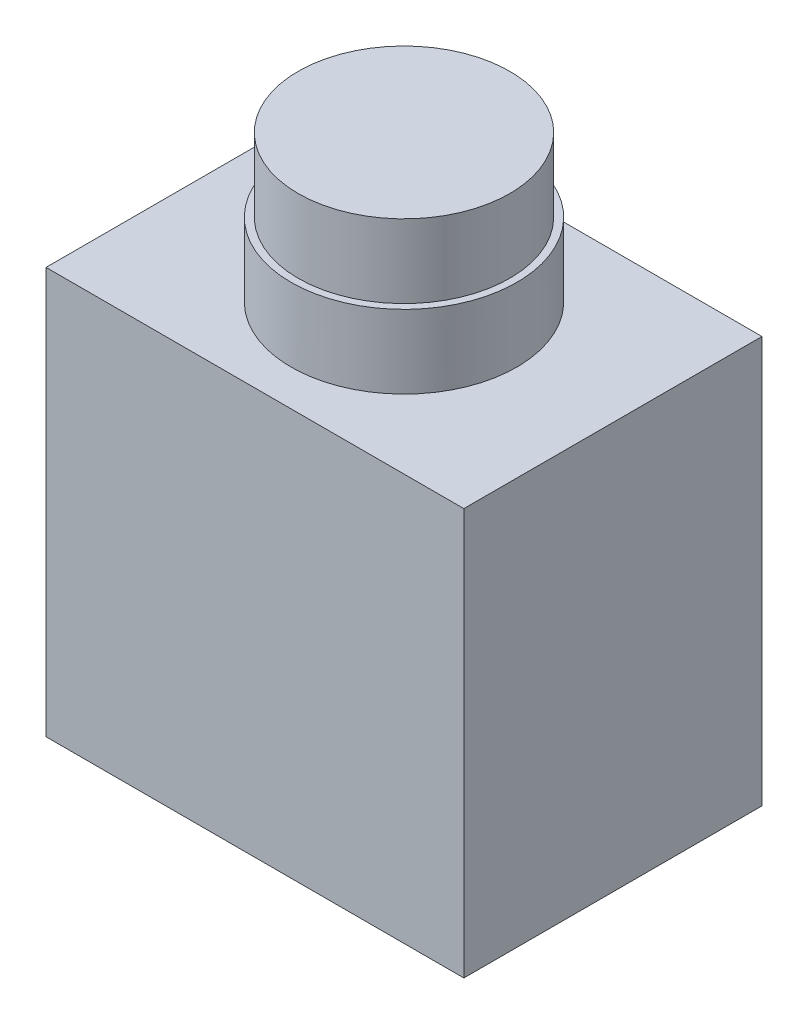
ISO-10303-21;
HEADER;
FILE_DESCRIPTION(('STEP AP214'),'2;1');
FILE_NAME('part.step','',(''),(''),'','','');
FILE_SCHEMA(('AUTOMOTIVE_DESIGN { 1 0 10303 214 1 1 1 1 }'));
ENDSEC;
DATA;
#1=APPLICATION_CONTEXT('core data for automotive mechanical design processes');
#2=APPLICATION_PROTOCOL_DEFINITION('international standard','automotive_design',2000,#1);
#3=PRODUCT_CONTEXT('',#1,'mechanical');
#4=PRODUCT('Part','Part','',(#3));
#5=PRODUCT_RELATED_PRODUCT_CATEGORY('part','',(#4));
#6=PRODUCT_DEFINITION_FORMATION('','',#4);
#7=PRODUCT_DEFINITION_CONTEXT('part definition',#1,'design');
#8=PRODUCT_DEFINITION('design','',#6,#7);
#9=PRODUCT_DEFINITION_SHAPE('','',#8);
#10=(LENGTH_UNIT() NAMED_UNIT(*) SI_UNIT(.MILLI.,.METRE.));
#11=(NAMED_UNIT(*) PLANE_ANGLE_UNIT() SI_UNIT($,.RADIAN.));
#12=(NAMED_UNIT(*) SI_UNIT($,.STERADIAN.) SOLID_ANGLE_UNIT());
#13=UNCERTAINTY_MEASURE_WITH_UNIT(LENGTH_MEASURE(1.E-05),#10,'distance_accuracy_value','');
#14=(GEOMETRIC_REPRESENTATION_CONTEXT(3) GLOBAL_UNCERTAINTY_ASSIGNED_CONTEXT((#13)) GLOBAL_UNIT_ASSIGNED_CONTEXT((#10,
#11,#12)) REPRESENTATION_CONTEXT('',''));
#15=CARTESIAN_POINT('',(0.,0.,0.));
#16=DIRECTION('',(0.,0.,1.));
#17=DIRECTION('',(1.,0.,0.));
#18=AXIS2_PLACEMENT_3D('',#15,#16,#17);
#19=CARTESIAN_POINT('',(11.7475,26.9875,-8.382));
#20=DIRECTION('',(0.,1.,0.));
#21=DIRECTION('',(0.,0.,1.));
#22=AXIS2_PLACEMENT_3D('',#19,#20,#21);
#23=PLANE('',#22);
#24=CARTESIAN_POINT('',(11.7475,26.9875,-8.382));
#25=DIRECTION('',(0.,1.,0.));
#26=DIRECTION('',(0.,0.,1.));
#27=AXIS2_PLACEMENT_3D('',#24,#25,#26);
#28=CIRCLE('',#27,6.35);
#29=CARTESIAN_POINT('',(11.7475,26.9875,-2.032));
#30=VERTEX_POINT('',#29);
#31=EDGE_CURVE('E106',#30,#30,#28,.T.);
#32=ORIENTED_EDGE('',*,*,#31,.T.);
#33=EDGE_LOOP('',(#32));
#34=FACE_BOUND('',#33,.T.);
#35=CARTESIAN_POINT('',(11.7475,26.9875,-8.382));
#36=DIRECTION('',(0.,1.,0.));
#37=DIRECTION('',(0.,0.,1.));
#38=AXIS2_PLACEMENT_3D('',#35,#36,#37);
#39=CIRCLE('',#38,5.953125);
#40=CARTESIAN_POINT('',(11.7475,26.9875,-2.428875));
#41=VERTEX_POINT('',#40);
#42=EDGE_CURVE('E148',#41,#41,#39,.T.);
#43=ORIENTED_EDGE('',*,*,#42,.F.);
#44=EDGE_LOOP('',(#43));
#45=FACE_BOUND('',#44,.T.);
#46=ADVANCED_FACE('F35',(#34,#45),#23,.T.);
#47=CARTESIAN_POINT('',(0.,22.86,0.));
#48=DIRECTION('',(0.,-1.,0.));
#49=DIRECTION('',(0.,0.,-1.));
#50=AXIS2_PLACEMENT_3D('',#47,#48,#49);
#51=PLANE('',#50);
#52=DIRECTION('',(0.,0.,1.));
#53=VECTOR('',#52,1.);
#54=CARTESIAN_POINT('',(0.,22.86,0.));
#55=LINE('',#54,#53);
#56=CARTESIAN_POINT('',(0.,22.86,-16.764));
#57=VERTEX_POINT('',#56);
#58=CARTESIAN_POINT('',(0.,22.86,0.));
#59=VERTEX_POINT('',#58);
#60=EDGE_CURVE('E89',#57,#59,#55,.T.);
#61=ORIENTED_EDGE('',*,*,#60,.T.);
#62=DIRECTION('',(1.,0.,0.));
#63=VECTOR('',#62,1.);
#64=CARTESIAN_POINT('',(0.,22.86,0.));
#65=LINE('',#64,#63);
#66=CARTESIAN_POINT('',(23.495,22.86,0.));
#67=VERTEX_POINT('',#66);
#68=EDGE_CURVE('E83',#59,#67,#65,.T.);
#69=ORIENTED_EDGE('',*,*,#68,.T.);
#70=DIRECTION('',(0.,0.,-1.));
#71=VECTOR('',#70,1.);
#72=CARTESIAN_POINT('',(23.495,22.86,0.));
#73=LINE('',#72,#71);
#74=CARTESIAN_POINT('',(23.495,22.86,-16.764));
#75=VERTEX_POINT('',#74);
#76=EDGE_CURVE('E87',#67,#75,#73,.T.);
#77=ORIENTED_EDGE('',*,*,#76,.T.);
#78=DIRECTION('',(-1.,0.,0.));
#79=VECTOR('',#78,1.);
#80=CARTESIAN_POINT('',(0.,22.86,-16.764));
#81=LINE('',#80,#79);
#82=EDGE_CURVE('E52',#75,#57,#81,.T.);
#83=ORIENTED_EDGE('',*,*,#82,.T.);
#84=EDGE_LOOP('',(#61,#69,#77,#83));
#85=FACE_BOUND('',#84,.T.);
#86=CARTESIAN_POINT('',(11.7475,22.86,-8.382));
#87=DIRECTION('',(0.,-1.,0.));
#88=DIRECTION('',(0.,0.,-1.));
#89=AXIS2_PLACEMENT_3D('',#86,#87,#88);
#90=CIRCLE('',#89,6.35);
#91=CARTESIAN_POINT('',(11.7475,22.86,-14.732));
#92=VERTEX_POINT('',#91);
#93=EDGE_CURVE('E11',#92,#92,#90,.F.);
#94=ORIENTED_EDGE('',*,*,#93,.F.);
#95=EDGE_LOOP('',(#94));
#96=FACE_BOUND('',#95,.T.);
#97=ADVANCED_FACE('F84',(#85,#96),#51,.F.);
#98=CARTESIAN_POINT('',(0.,22.86,0.));
#99=DIRECTION('',(1.,0.,0.));
#100=DIRECTION('',(0.,0.,-1.));
#101=AXIS2_PLACEMENT_3D('',#98,#99,#100);
#102=PLANE('',#101);
#103=DIRECTION('',(0.,0.,1.));
#104=VECTOR('',#103,1.);
#105=CARTESIAN_POINT('',(0.,0.,0.));
#106=LINE('',#105,#104);
#107=CARTESIAN_POINT('',(0.,0.,-16.764));
#108=VERTEX_POINT('',#107);
#109=CARTESIAN_POINT('',(0.,0.,0.));
#110=VERTEX_POINT('',#109);
#111=EDGE_CURVE('E103',#108,#110,#106,.T.);
#112=ORIENTED_EDGE('',*,*,#111,.T.);
#113=DIRECTION('',(0.,-1.,0.));
#114=VECTOR('',#113,1.);
#115=CARTESIAN_POINT('',(0.,22.86,0.));
#116=LINE('',#115,#114);
#117=EDGE_CURVE('E44',#59,#110,#116,.T.);
#118=ORIENTED_EDGE('',*,*,#117,.F.);
#119=ORIENTED_EDGE('',*,*,#60,.F.);
#120=DIRECTION('',(0.,-1.,0.));
#121=VECTOR('',#120,1.);
#122=CARTESIAN_POINT('',(0.,22.86,-16.764));
#123=LINE('',#122,#121);
#124=EDGE_CURVE('E99',#57,#108,#123,.T.);
#125=ORIENTED_EDGE('',*,*,#124,.T.);
#126=EDGE_LOOP('',(#112,#118,#119,#125));
#127=FACE_BOUND('',#126,.T.);
#128=ADVANCED_FACE('F37',(#127),#102,.F.);
#129=CARTESIAN_POINT('',(0.,22.86,0.));
#130=DIRECTION('',(0.,0.,-1.));
#131=DIRECTION('',(-1.,0.,0.));
#132=AXIS2_PLACEMENT_3D('',#129,#130,#131);
#133=PLANE('',#132);
#134=DIRECTION('',(1.,0.,0.));
#135=VECTOR('',#134,1.);
#136=CARTESIAN_POINT('',(0.,0.,0.));
#137=LINE('',#136,#135);
#138=CARTESIAN_POINT('',(23.495,0.,0.));
#139=VERTEX_POINT('',#138);
#140=EDGE_CURVE('E94',#110,#139,#137,.T.);
#141=ORIENTED_EDGE('',*,*,#140,.T.);
#142=DIRECTION('',(0.,-1.,0.));
#143=VECTOR('',#142,1.);
#144=CARTESIAN_POINT('',(23.495,22.86,0.));
#145=LINE('',#144,#143);
#146=EDGE_CURVE('E92',#67,#139,#145,.T.);
#147=ORIENTED_EDGE('',*,*,#146,.F.);
#148=ORIENTED_EDGE('',*,*,#68,.F.);
#149=ORIENTED_EDGE('',*,*,#117,.T.);
#150=EDGE_LOOP('',(#141,#147,#148,#149));
#151=FACE_BOUND('',#150,.T.);
#152=ADVANCED_FACE('F93',(#151),#133,.F.);
#153=CARTESIAN_POINT('',(23.495,22.86,0.));
#154=DIRECTION('',(-1.,0.,0.));
#155=DIRECTION('',(0.,0.,1.));
#156=AXIS2_PLACEMENT_3D('',#153,#154,#155);
#157=PLANE('',#156);
#158=DIRECTION('',(0.,0.,-1.));
#159=VECTOR('',#158,1.);
#160=CARTESIAN_POINT('',(23.495,0.,0.));
#161=LINE('',#160,#159);
#162=CARTESIAN_POINT('',(23.495,0.,-16.764));
#163=VERTEX_POINT('',#162);
#164=EDGE_CURVE('E69',#139,#163,#161,.T.);
#165=ORIENTED_EDGE('',*,*,#164,.T.);
#166=DIRECTION('',(0.,-1.,0.));
#167=VECTOR('',#166,1.);
#168=CARTESIAN_POINT('',(23.495,22.86,-16.764));
#169=LINE('',#168,#167);
#170=EDGE_CURVE('E95',#75,#163,#169,.T.);
#171=ORIENTED_EDGE('',*,*,#170,.F.);
#172=ORIENTED_EDGE('',*,*,#76,.F.);
#173=ORIENTED_EDGE('',*,*,#146,.T.);
#174=EDGE_LOOP('',(#165,#171,#172,#173));
#175=FACE_BOUND('',#174,.T.);
#176=ADVANCED_FACE('F97',(#175),#157,.F.);
#177=CARTESIAN_POINT('',(0.,22.86,-16.764));
#178=DIRECTION('',(0.,0.,1.));
#179=DIRECTION('',(1.,0.,0.));
#180=AXIS2_PLACEMENT_3D('',#177,#178,#179);
#181=PLANE('',#180);
#182=DIRECTION('',(-1.,0.,0.));
#183=VECTOR('',#182,1.);
#184=CARTESIAN_POINT('',(0.,0.,-16.764));
#185=LINE('',#184,#183);
#186=EDGE_CURVE('E75',#163,#108,#185,.T.);
#187=ORIENTED_EDGE('',*,*,#186,.T.);
#188=ORIENTED_EDGE('',*,*,#124,.F.);
#189=ORIENTED_EDGE('',*,*,#82,.F.);
#190=ORIENTED_EDGE('',*,*,#170,.T.);
#191=EDGE_LOOP('',(#187,#188,#189,#190));
#192=FACE_BOUND('',#191,.T.);
#193=ADVANCED_FACE('F117',(#192),#181,.F.);
#194=CARTESIAN_POINT('',(0.,0.,0.));
#195=DIRECTION('',(0.,-1.,0.));
#196=DIRECTION('',(0.,0.,-1.));
#197=AXIS2_PLACEMENT_3D('',#194,#195,#196);
#198=PLANE('',#197);
#199=ORIENTED_EDGE('',*,*,#111,.F.);
#200=ORIENTED_EDGE('',*,*,#186,.F.);
#201=ORIENTED_EDGE('',*,*,#164,.F.);
#202=ORIENTED_EDGE('',*,*,#140,.F.);
#203=EDGE_LOOP('',(#199,#200,#201,#202));
#204=FACE_BOUND('',#203,.T.);
#205=ADVANCED_FACE('F114',(#204),#198,.T.);
#206=CARTESIAN_POINT('',(11.7475,26.9875,-8.382));
#207=DIRECTION('',(0.,-1.,0.));
#208=DIRECTION('',(0.,0.,-1.));
#209=AXIS2_PLACEMENT_3D('',#206,#207,#208);
#210=CYLINDRICAL_SURFACE('',#209,6.35);
#211=ORIENTED_EDGE('',*,*,#31,.F.);
#212=EDGE_LOOP('',(#211));
#213=FACE_BOUND('',#212,.T.);
#214=ORIENTED_EDGE('',*,*,#93,.T.);
#215=EDGE_LOOP('',(#214));
#216=FACE_BOUND('',#215,.T.);
#217=ADVANCED_FACE('F116',(#213,#216),#210,.T.);
#218=CARTESIAN_POINT('',(11.7475,31.115,-8.382));
#219=DIRECTION('',(0.,-1.,0.));
#220=DIRECTION('',(0.,0.,-1.));
#221=AXIS2_PLACEMENT_3D('',#218,#219,#220);
#222=CYLINDRICAL_SURFACE('',#221,5.953125);
#223=CARTESIAN_POINT('',(11.7475,31.115,-8.382));
#224=DIRECTION('',(0.,1.,0.));
#225=DIRECTION('',(0.,0.,1.));
#226=AXIS2_PLACEMENT_3D('',#223,#224,#225);
#227=CIRCLE('',#226,5.953125);
#228=CARTESIAN_POINT('',(11.7475,31.115,-2.428875));
#229=VERTEX_POINT('',#228);
#230=EDGE_CURVE('E147',#229,#229,#227,.T.);
#231=ORIENTED_EDGE('',*,*,#230,.F.);
#232=EDGE_LOOP('',(#231));
#233=FACE_BOUND('',#232,.T.);
#234=ORIENTED_EDGE('',*,*,#42,.T.);
#235=EDGE_LOOP('',(#234));
#236=FACE_BOUND('',#235,.T.);
#237=ADVANCED_FACE('F123',(#233,#236),#222,.T.);
#238=CARTESIAN_POINT('',(11.7475,31.115,-8.382));
#239=DIRECTION('',(0.,1.,0.));
#240=DIRECTION('',(0.,0.,1.));
#241=AXIS2_PLACEMENT_3D('',#238,#239,#240);
#242=PLANE('',#241);
#243=ORIENTED_EDGE('',*,*,#230,.T.);
#244=EDGE_LOOP('',(#243));
#245=FACE_BOUND('',#244,.T.);
#246=ADVANCED_FACE('F139',(#245),#242,.T.);
#247=CLOSED_SHELL('',(#46,#97,#128,#152,#176,#193,#205,#217,#237,#246));
#248=MANIFOLD_SOLID_BREP('B2',#247);
#249=ADVANCED_BREP_SHAPE_REPRESENTATION('',(#18,#248),#14);
#250=SHAPE_DEFINITION_REPRESENTATION(#9,#249);
ENDSEC;
END-ISO-10303-21;
